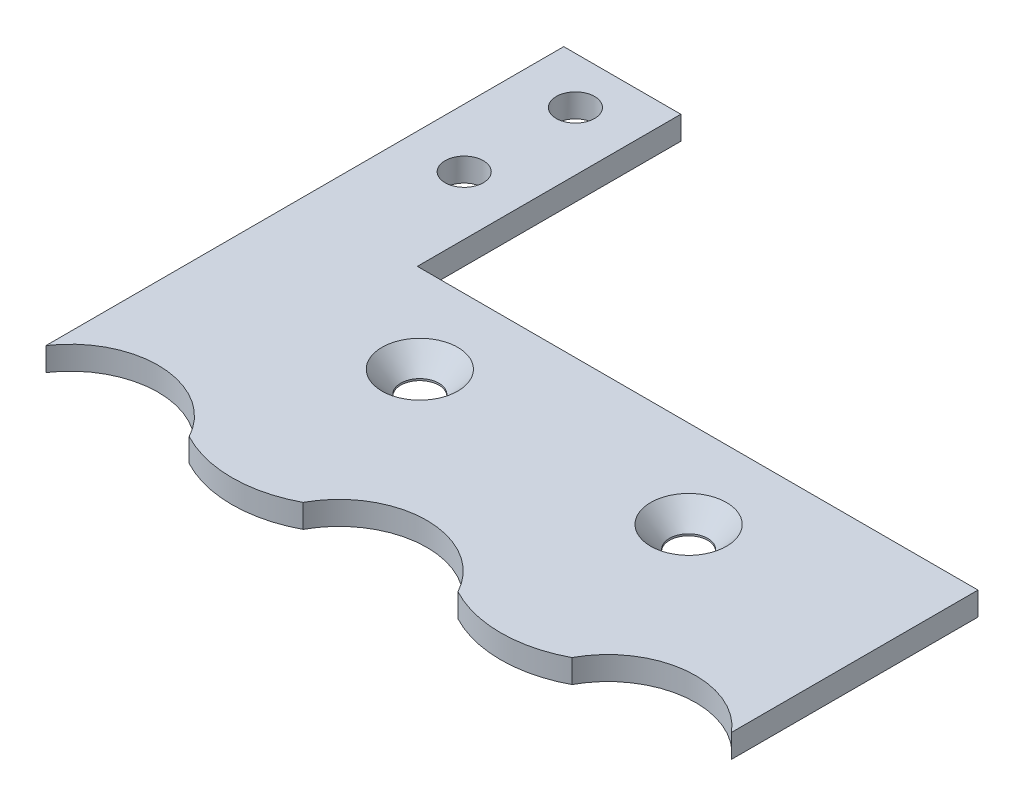
ISO-10303-21;
HEADER;
FILE_DESCRIPTION(('STEP AP214'),'2;1');
FILE_NAME('part.step','',(''),(''),'','','');
FILE_SCHEMA(('AUTOMOTIVE_DESIGN { 1 0 10303 214 1 1 1 1 }'));
ENDSEC;
DATA;
#1=APPLICATION_CONTEXT('core data for automotive mechanical design processes');
#2=APPLICATION_PROTOCOL_DEFINITION('international standard','automotive_design',2000,#1);
#3=PRODUCT_CONTEXT('',#1,'mechanical');
#4=PRODUCT('Part','Part','',(#3));
#5=PRODUCT_RELATED_PRODUCT_CATEGORY('part','',(#4));
#6=PRODUCT_DEFINITION_FORMATION('','',#4);
#7=PRODUCT_DEFINITION_CONTEXT('part definition',#1,'design');
#8=PRODUCT_DEFINITION('design','',#6,#7);
#9=PRODUCT_DEFINITION_SHAPE('','',#8);
#10=(LENGTH_UNIT() NAMED_UNIT(*) SI_UNIT(.MILLI.,.METRE.));
#11=(NAMED_UNIT(*) PLANE_ANGLE_UNIT() SI_UNIT($,.RADIAN.));
#12=(NAMED_UNIT(*) SI_UNIT($,.STERADIAN.) SOLID_ANGLE_UNIT());
#13=UNCERTAINTY_MEASURE_WITH_UNIT(LENGTH_MEASURE(1.E-05),#10,'distance_accuracy_value','');
#14=(GEOMETRIC_REPRESENTATION_CONTEXT(3) GLOBAL_UNCERTAINTY_ASSIGNED_CONTEXT((#13)) GLOBAL_UNIT_ASSIGNED_CONTEXT((#10,
#11,#12)) REPRESENTATION_CONTEXT('',''));
#15=CARTESIAN_POINT('',(0.,0.,0.));
#16=DIRECTION('',(0.,0.,1.));
#17=DIRECTION('',(1.,0.,0.));
#18=AXIS2_PLACEMENT_3D('',#15,#16,#17);
#19=CARTESIAN_POINT('',(-22.95,-2.,0.));
#20=DIRECTION('',(0.,-1.,0.));
#21=DIRECTION('',(0.,0.,-1.));
#22=AXIS2_PLACEMENT_3D('',#19,#20,#21);
#23=PLANE('',#22);
#24=DIRECTION('',(0.,0.,1.));
#25=VECTOR('',#24,1.);
#26=CARTESIAN_POINT('',(28.6876437453176,-2.,-25.875));
#27=LINE('',#26,#25);
#28=CARTESIAN_POINT('',(28.6876437453176,-2.,-25.875));
#29=VERTEX_POINT('',#28);
#30=CARTESIAN_POINT('',(28.6876437453176,-2.,-4.8300563404393));
#31=VERTEX_POINT('',#30);
#32=EDGE_CURVE('E130',#29,#31,#27,.T.);
#33=ORIENTED_EDGE('',*,*,#32,.T.);
#34=CARTESIAN_POINT('',(22.95,-2.,0.));
#35=DIRECTION('',(0.,-1.,0.));
#36=DIRECTION('',(0.,0.,-1.));
#37=AXIS2_PLACEMENT_3D('',#34,#35,#36);
#38=CIRCLE('',#37,7.5);
#39=CARTESIAN_POINT('',(16.3401340624036,-2.,-3.54396279424643));
#40=VERTEX_POINT('',#39);
#41=EDGE_CURVE('E200',#31,#40,#38,.F.);
#42=ORIENTED_EDGE('',*,*,#41,.T.);
#43=CARTESIAN_POINT('',(11.475,-2.,-12.7075371817243));
#44=DIRECTION('',(0.,-1.,0.));
#45=DIRECTION('',(0.,0.,-1.));
#46=AXIS2_PLACEMENT_3D('',#43,#44,#45);
#47=CIRCLE('',#46,10.375);
#48=CARTESIAN_POINT('',(6.6098659375964,-2.,-3.54396279424642));
#49=VERTEX_POINT('',#48);
#50=EDGE_CURVE('E196',#40,#49,#47,.T.);
#51=ORIENTED_EDGE('',*,*,#50,.T.);
#52=CARTESIAN_POINT('',(0.,-2.,0.));
#53=DIRECTION('',(0.,-1.,0.));
#54=DIRECTION('',(0.,0.,-1.));
#55=AXIS2_PLACEMENT_3D('',#52,#53,#54);
#56=CIRCLE('',#55,7.5);
#57=CARTESIAN_POINT('',(-6.6098659375964,-2.,-3.54396279424642));
#58=VERTEX_POINT('',#57);
#59=EDGE_CURVE('E192',#49,#58,#56,.F.);
#60=ORIENTED_EDGE('',*,*,#59,.T.);
#61=CARTESIAN_POINT('',(-11.475,-2.,-12.7075371817243));
#62=DIRECTION('',(0.,-1.,0.));
#63=DIRECTION('',(0.,0.,-1.));
#64=AXIS2_PLACEMENT_3D('',#61,#62,#63);
#65=CIRCLE('',#64,10.375);
#66=CARTESIAN_POINT('',(-16.3401340624036,-2.,-3.54396279424642));
#67=VERTEX_POINT('',#66);
#68=EDGE_CURVE('E188',#58,#67,#65,.T.);
#69=ORIENTED_EDGE('',*,*,#68,.T.);
#70=CARTESIAN_POINT('',(-22.95,-2.,0.));
#71=DIRECTION('',(0.,-1.,0.));
#72=DIRECTION('',(0.,0.,-1.));
#73=AXIS2_PLACEMENT_3D('',#70,#71,#72);
#74=CIRCLE('',#73,7.5);
#75=CARTESIAN_POINT('',(-29.1876437453176,-2.,-4.16434874938448));
#76=VERTEX_POINT('',#75);
#77=EDGE_CURVE('E183',#67,#76,#74,.F.);
#78=ORIENTED_EDGE('',*,*,#77,.T.);
#79=DIRECTION('',(0.,0.,1.));
#80=VECTOR('',#79,1.);
#81=CARTESIAN_POINT('',(-29.1876437453176,-2.,-25.875));
#82=LINE('',#81,#80);
#83=CARTESIAN_POINT('',(-29.1876437453176,-2.,-48.375));
#84=VERTEX_POINT('',#83);
#85=EDGE_CURVE('E159',#84,#76,#82,.T.);
#86=ORIENTED_EDGE('',*,*,#85,.F.);
#87=DIRECTION('',(-1.,0.,0.));
#88=VECTOR('',#87,1.);
#89=CARTESIAN_POINT('',(-29.1876437453176,-2.,-48.375));
#90=LINE('',#89,#88);
#91=CARTESIAN_POINT('',(-19.1876437453176,-2.,-48.375));
#92=VERTEX_POINT('',#91);
#93=EDGE_CURVE('E149',#92,#84,#90,.T.);
#94=ORIENTED_EDGE('',*,*,#93,.F.);
#95=DIRECTION('',(0.,0.,-1.));
#96=VECTOR('',#95,1.);
#97=CARTESIAN_POINT('',(-19.1876437453176,-2.,-48.375));
#98=LINE('',#97,#96);
#99=CARTESIAN_POINT('',(-19.1876437453176,-2.,-25.875));
#100=VERTEX_POINT('',#99);
#101=EDGE_CURVE('E147',#100,#92,#98,.T.);
#102=ORIENTED_EDGE('',*,*,#101,.F.);
#103=DIRECTION('',(-1.,0.,0.));
#104=VECTOR('',#103,1.);
#105=CARTESIAN_POINT('',(-19.1876437453176,-2.,-25.875));
#106=LINE('',#105,#104);
#107=EDGE_CURVE('E88',#29,#100,#106,.T.);
#108=ORIENTED_EDGE('',*,*,#107,.F.);
#109=EDGE_LOOP('',(#33,#42,#51,#60,#69,#78,#86,#94,#102,#108));
#110=FACE_BOUND('',#109,.T.);
#111=CARTESIAN_POINT('',(11.475,-2.,-18.375));
#112=DIRECTION('',(0.,-1.,0.));
#113=DIRECTION('',(0.,0.,-1.));
#114=AXIS2_PLACEMENT_3D('',#111,#112,#113);
#115=CIRCLE('',#114,1.63194999999999);
#116=CARTESIAN_POINT('',(11.475,-2.,-20.00695));
#117=VERTEX_POINT('',#116);
#118=EDGE_CURVE('E222',#117,#117,#115,.F.);
#119=ORIENTED_EDGE('',*,*,#118,.T.);
#120=EDGE_LOOP('',(#119));
#121=FACE_BOUND('',#120,.T.);
#122=CARTESIAN_POINT('',(-24.1876437453176,-2.,-44.375));
#123=DIRECTION('',(0.,-1.,0.));
#124=DIRECTION('',(0.,0.,-1.));
#125=AXIS2_PLACEMENT_3D('',#122,#123,#124);
#126=CIRCLE('',#125,1.635);
#127=CARTESIAN_POINT('',(-24.1876437453176,-2.,-46.01));
#128=VERTEX_POINT('',#127);
#129=EDGE_CURVE('E163',#128,#128,#126,.F.);
#130=ORIENTED_EDGE('',*,*,#129,.T.);
#131=EDGE_LOOP('',(#130));
#132=FACE_BOUND('',#131,.T.);
#133=CARTESIAN_POINT('',(-24.1876437453176,-2.,-34.875));
#134=DIRECTION('',(0.,-1.,0.));
#135=DIRECTION('',(0.,0.,-1.));
#136=AXIS2_PLACEMENT_3D('',#133,#134,#135);
#137=CIRCLE('',#136,1.635);
#138=CARTESIAN_POINT('',(-24.1876437453176,-2.,-36.51));
#139=VERTEX_POINT('',#138);
#140=EDGE_CURVE('E221',#139,#139,#137,.F.);
#141=ORIENTED_EDGE('',*,*,#140,.T.);
#142=EDGE_LOOP('',(#141));
#143=FACE_BOUND('',#142,.T.);
#144=CARTESIAN_POINT('',(-11.475,-2.,-18.375));
#145=DIRECTION('',(0.,-1.,0.));
#146=DIRECTION('',(0.,0.,-1.));
#147=AXIS2_PLACEMENT_3D('',#144,#145,#146);
#148=CIRCLE('',#147,1.63194999999999);
#149=CARTESIAN_POINT('',(-11.475,-2.,-20.00695));
#150=VERTEX_POINT('',#149);
#151=EDGE_CURVE('E213',#150,#150,#148,.F.);
#152=ORIENTED_EDGE('',*,*,#151,.T.);
#153=EDGE_LOOP('',(#152));
#154=FACE_BOUND('',#153,.T.);
#155=ADVANCED_FACE('F42',(#110,#121,#132,#143,#154),#23,.T.);
#156=CARTESIAN_POINT('',(-29.1876437453176,-2.,-3.17675943478572));
#157=DIRECTION('',(-1.,0.,0.));
#158=DIRECTION('',(0.,0.,1.));
#159=AXIS2_PLACEMENT_3D('',#156,#157,#158);
#160=PLANE('',#159);
#161=DIRECTION('',(0.,1.,0.));
#162=VECTOR('',#161,1.);
#163=CARTESIAN_POINT('',(-29.1876437453176,-72.327221103341,-4.16434874938448));
#164=LINE('',#163,#162);
#165=CARTESIAN_POINT('',(-29.1876437453176,0.,-4.16434874938448));
#166=VERTEX_POINT('',#165);
#167=EDGE_CURVE('E186',#166,#76,#164,.F.);
#168=ORIENTED_EDGE('',*,*,#167,.F.);
#169=DIRECTION('',(0.,0.,1.));
#170=VECTOR('',#169,1.);
#171=CARTESIAN_POINT('',(-29.1876437453176,0.,-3.17675943478572));
#172=LINE('',#171,#170);
#173=CARTESIAN_POINT('',(-29.1876437453176,0.,-48.375));
#174=VERTEX_POINT('',#173);
#175=EDGE_CURVE('E82',#174,#166,#172,.T.);
#176=ORIENTED_EDGE('',*,*,#175,.F.);
#177=DIRECTION('',(0.,1.,0.));
#178=VECTOR('',#177,1.);
#179=CARTESIAN_POINT('',(-29.1876437453176,-2.,-48.375));
#180=LINE('',#179,#178);
#181=EDGE_CURVE('E11',#84,#174,#180,.T.);
#182=ORIENTED_EDGE('',*,*,#181,.F.);
#183=ORIENTED_EDGE('',*,*,#85,.T.);
#184=EDGE_LOOP('',(#168,#176,#182,#183));
#185=FACE_BOUND('',#184,.T.);
#186=ADVANCED_FACE('F255',(#185),#160,.T.);
#187=CARTESIAN_POINT('',(-29.1876437453176,-2.,-48.375));
#188=DIRECTION('',(0.,0.,-1.));
#189=DIRECTION('',(-1.,0.,0.));
#190=AXIS2_PLACEMENT_3D('',#187,#188,#189);
#191=PLANE('',#190);
#192=DIRECTION('',(-1.,0.,0.));
#193=VECTOR('',#192,1.);
#194=CARTESIAN_POINT('',(-29.1876437453176,0.,-48.375));
#195=LINE('',#194,#193);
#196=CARTESIAN_POINT('',(-19.1876437453176,0.,-48.375));
#197=VERTEX_POINT('',#196);
#198=EDGE_CURVE('E151',#197,#174,#195,.T.);
#199=ORIENTED_EDGE('',*,*,#198,.F.);
#200=DIRECTION('',(0.,1.,0.));
#201=VECTOR('',#200,1.);
#202=CARTESIAN_POINT('',(-19.1876437453176,-2.,-48.375));
#203=LINE('',#202,#201);
#204=EDGE_CURVE('E51',#92,#197,#203,.T.);
#205=ORIENTED_EDGE('',*,*,#204,.F.);
#206=ORIENTED_EDGE('',*,*,#93,.T.);
#207=ORIENTED_EDGE('',*,*,#181,.T.);
#208=EDGE_LOOP('',(#199,#205,#206,#207));
#209=FACE_BOUND('',#208,.T.);
#210=ADVANCED_FACE('F260',(#209),#191,.T.);
#211=CARTESIAN_POINT('',(-19.1876437453176,-2.,-48.375));
#212=DIRECTION('',(1.,0.,0.));
#213=DIRECTION('',(0.,0.,-1.));
#214=AXIS2_PLACEMENT_3D('',#211,#212,#213);
#215=PLANE('',#214);
#216=DIRECTION('',(0.,0.,-1.));
#217=VECTOR('',#216,1.);
#218=CARTESIAN_POINT('',(-19.1876437453176,0.,-48.375));
#219=LINE('',#218,#217);
#220=CARTESIAN_POINT('',(-19.1876437453176,0.,-25.875));
#221=VERTEX_POINT('',#220);
#222=EDGE_CURVE('E162',#221,#197,#219,.T.);
#223=ORIENTED_EDGE('',*,*,#222,.F.);
#224=DIRECTION('',(0.,1.,0.));
#225=VECTOR('',#224,1.);
#226=CARTESIAN_POINT('',(-19.1876437453176,-2.,-25.875));
#227=LINE('',#226,#225);
#228=EDGE_CURVE('E46',#100,#221,#227,.T.);
#229=ORIENTED_EDGE('',*,*,#228,.F.);
#230=ORIENTED_EDGE('',*,*,#101,.T.);
#231=ORIENTED_EDGE('',*,*,#204,.T.);
#232=EDGE_LOOP('',(#223,#229,#230,#231));
#233=FACE_BOUND('',#232,.T.);
#234=ADVANCED_FACE('F170',(#233),#215,.T.);
#235=CARTESIAN_POINT('',(-19.1876437453176,-2.,-25.875));
#236=DIRECTION('',(0.,0.,-1.));
#237=DIRECTION('',(-1.,0.,0.));
#238=AXIS2_PLACEMENT_3D('',#235,#236,#237);
#239=PLANE('',#238);
#240=DIRECTION('',(0.,1.,0.));
#241=VECTOR('',#240,1.);
#242=CARTESIAN_POINT('',(28.6876437453176,-72.327221103341,-25.875));
#243=LINE('',#242,#241);
#244=CARTESIAN_POINT('',(28.6876437453176,0.,-25.875));
#245=VERTEX_POINT('',#244);
#246=EDGE_CURVE('E133',#29,#245,#243,.T.);
#247=ORIENTED_EDGE('',*,*,#246,.F.);
#248=ORIENTED_EDGE('',*,*,#107,.T.);
#249=ORIENTED_EDGE('',*,*,#228,.T.);
#250=DIRECTION('',(-1.,0.,0.));
#251=VECTOR('',#250,1.);
#252=CARTESIAN_POINT('',(-19.1876437453176,0.,-25.875));
#253=LINE('',#252,#251);
#254=EDGE_CURVE('E140',#245,#221,#253,.T.);
#255=ORIENTED_EDGE('',*,*,#254,.F.);
#256=EDGE_LOOP('',(#247,#248,#249,#255));
#257=FACE_BOUND('',#256,.T.);
#258=ADVANCED_FACE('F44',(#257),#239,.T.);
#259=CARTESIAN_POINT('',(-22.95,0.,0.));
#260=DIRECTION('',(0.,-1.,0.));
#261=DIRECTION('',(0.,0.,-1.));
#262=AXIS2_PLACEMENT_3D('',#259,#260,#261);
#263=PLANE('',#262);
#264=CARTESIAN_POINT('',(-11.475,0.,-18.375));
#265=DIRECTION('',(0.,1.,0.));
#266=DIRECTION('',(0.,0.,1.));
#267=AXIS2_PLACEMENT_3D('',#264,#265,#266);
#268=CIRCLE('',#267,3.2385);
#269=CARTESIAN_POINT('',(-11.475,0.,-15.1365));
#270=VERTEX_POINT('',#269);
#271=EDGE_CURVE('E208',#270,#270,#268,.T.);
#272=ORIENTED_EDGE('',*,*,#271,.F.);
#273=EDGE_LOOP('',(#272));
#274=FACE_BOUND('',#273,.T.);
#275=CARTESIAN_POINT('',(11.475,0.,-18.375));
#276=DIRECTION('',(0.,1.,0.));
#277=DIRECTION('',(0.,0.,1.));
#278=AXIS2_PLACEMENT_3D('',#275,#276,#277);
#279=CIRCLE('',#278,3.2385);
#280=CARTESIAN_POINT('',(11.475,0.,-15.1365));
#281=VERTEX_POINT('',#280);
#282=EDGE_CURVE('E212',#281,#281,#279,.T.);
#283=ORIENTED_EDGE('',*,*,#282,.F.);
#284=EDGE_LOOP('',(#283));
#285=FACE_BOUND('',#284,.T.);
#286=CARTESIAN_POINT('',(-24.1876437453176,0.,-44.375));
#287=DIRECTION('',(0.,1.,0.));
#288=DIRECTION('',(0.,0.,1.));
#289=AXIS2_PLACEMENT_3D('',#286,#287,#288);
#290=CIRCLE('',#289,1.635);
#291=CARTESIAN_POINT('',(-24.1876437453176,0.,-42.74));
#292=VERTEX_POINT('',#291);
#293=EDGE_CURVE('E227',#292,#292,#290,.T.);
#294=ORIENTED_EDGE('',*,*,#293,.F.);
#295=EDGE_LOOP('',(#294));
#296=FACE_BOUND('',#295,.T.);
#297=CARTESIAN_POINT('',(-24.1876437453176,0.,-34.875));
#298=DIRECTION('',(0.,1.,0.));
#299=DIRECTION('',(0.,0.,1.));
#300=AXIS2_PLACEMENT_3D('',#297,#298,#299);
#301=CIRCLE('',#300,1.635);
#302=CARTESIAN_POINT('',(-24.1876437453176,0.,-33.24));
#303=VERTEX_POINT('',#302);
#304=EDGE_CURVE('E154',#303,#303,#301,.T.);
#305=ORIENTED_EDGE('',*,*,#304,.F.);
#306=EDGE_LOOP('',(#305));
#307=FACE_BOUND('',#306,.T.);
#308=CARTESIAN_POINT('',(22.95,0.,0.));
#309=DIRECTION('',(0.,1.,0.));
#310=DIRECTION('',(0.,0.,1.));
#311=AXIS2_PLACEMENT_3D('',#308,#309,#310);
#312=CIRCLE('',#311,7.5);
#313=CARTESIAN_POINT('',(28.6876437453176,0.,-4.8300563404393));
#314=VERTEX_POINT('',#313);
#315=CARTESIAN_POINT('',(16.3401340624036,0.,-3.54396279424643));
#316=VERTEX_POINT('',#315);
#317=EDGE_CURVE('E177',#314,#316,#312,.T.);
#318=ORIENTED_EDGE('',*,*,#317,.F.);
#319=DIRECTION('',(0.,0.,1.));
#320=VECTOR('',#319,1.);
#321=CARTESIAN_POINT('',(28.6876437453176,0.,-25.875));
#322=LINE('',#321,#320);
#323=EDGE_CURVE('E174',#245,#314,#322,.T.);
#324=ORIENTED_EDGE('',*,*,#323,.F.);
#325=ORIENTED_EDGE('',*,*,#254,.T.);
#326=ORIENTED_EDGE('',*,*,#222,.T.);
#327=ORIENTED_EDGE('',*,*,#198,.T.);
#328=ORIENTED_EDGE('',*,*,#175,.T.);
#329=CARTESIAN_POINT('',(-22.95,0.,0.));
#330=DIRECTION('',(0.,1.,0.));
#331=DIRECTION('',(0.,0.,1.));
#332=AXIS2_PLACEMENT_3D('',#329,#330,#331);
#333=CIRCLE('',#332,7.5);
#334=CARTESIAN_POINT('',(-16.3401340624036,0.,-3.54396279424642));
#335=VERTEX_POINT('',#334);
#336=EDGE_CURVE('E141',#335,#166,#333,.T.);
#337=ORIENTED_EDGE('',*,*,#336,.F.);
#338=CARTESIAN_POINT('',(-11.475,0.,-12.7075371817243));
#339=DIRECTION('',(0.,-1.,0.));
#340=DIRECTION('',(0.,0.,1.));
#341=AXIS2_PLACEMENT_3D('',#338,#339,#340);
#342=CIRCLE('',#341,10.375);
#343=CARTESIAN_POINT('',(-6.6098659375964,0.,-3.54396279424642));
#344=VERTEX_POINT('',#343);
#345=EDGE_CURVE('E59',#344,#335,#342,.T.);
#346=ORIENTED_EDGE('',*,*,#345,.F.);
#347=CARTESIAN_POINT('',(0.,0.,0.));
#348=DIRECTION('',(0.,1.,0.));
#349=DIRECTION('',(0.,0.,1.));
#350=AXIS2_PLACEMENT_3D('',#347,#348,#349);
#351=CIRCLE('',#350,7.5);
#352=CARTESIAN_POINT('',(6.6098659375964,0.,-3.54396279424642));
#353=VERTEX_POINT('',#352);
#354=EDGE_CURVE('E306',#353,#344,#351,.T.);
#355=ORIENTED_EDGE('',*,*,#354,.F.);
#356=CARTESIAN_POINT('',(11.475,0.,-12.7075371817243));
#357=DIRECTION('',(0.,-1.,0.));
#358=DIRECTION('',(0.,0.,1.));
#359=AXIS2_PLACEMENT_3D('',#356,#357,#358);
#360=CIRCLE('',#359,10.375);
#361=EDGE_CURVE('E179',#316,#353,#360,.T.);
#362=ORIENTED_EDGE('',*,*,#361,.F.);
#363=EDGE_LOOP('',(#318,#324,#325,#326,#327,#328,#337,#346,#355,#362));
#364=FACE_BOUND('',#363,.T.);
#365=ADVANCED_FACE('F173',(#274,#285,#296,#307,#364),#263,.F.);
#366=CARTESIAN_POINT('',(-24.1876437453176,-6.62447834896003,-34.875));
#367=DIRECTION('',(0.,1.,0.));
#368=DIRECTION('',(0.,0.,1.));
#369=AXIS2_PLACEMENT_3D('',#366,#367,#368);
#370=CYLINDRICAL_SURFACE('',#369,1.635);
#371=ORIENTED_EDGE('',*,*,#304,.T.);
#372=EDGE_LOOP('',(#371));
#373=FACE_BOUND('',#372,.T.);
#374=ORIENTED_EDGE('',*,*,#140,.F.);
#375=EDGE_LOOP('',(#374));
#376=FACE_BOUND('',#375,.T.);
#377=ADVANCED_FACE('F237',(#373,#376),#370,.F.);
#378=CARTESIAN_POINT('',(-24.1876437453176,-6.62447834896003,-44.375));
#379=DIRECTION('',(0.,1.,0.));
#380=DIRECTION('',(0.,0.,1.));
#381=AXIS2_PLACEMENT_3D('',#378,#379,#380);
#382=CYLINDRICAL_SURFACE('',#381,1.635);
#383=ORIENTED_EDGE('',*,*,#293,.T.);
#384=EDGE_LOOP('',(#383));
#385=FACE_BOUND('',#384,.T.);
#386=ORIENTED_EDGE('',*,*,#129,.F.);
#387=EDGE_LOOP('',(#386));
#388=FACE_BOUND('',#387,.T.);
#389=ADVANCED_FACE('F248',(#385,#388),#382,.F.);
#390=CARTESIAN_POINT('',(11.475,0.,-18.375));
#391=DIRECTION('',(0.,1.,0.));
#392=DIRECTION('',(0.,0.,1.));
#393=AXIS2_PLACEMENT_3D('',#390,#391,#392);
#394=CYLINDRICAL_SURFACE('',#393,1.63194999999999);
#395=ORIENTED_EDGE('',*,*,#118,.F.);
#396=EDGE_LOOP('',(#395));
#397=FACE_BOUND('',#396,.T.);
#398=CARTESIAN_POINT('',(11.475,-1.84812436462092,-18.375));
#399=DIRECTION('',(0.,1.,0.));
#400=DIRECTION('',(0.,0.,1.));
#401=AXIS2_PLACEMENT_3D('',#398,#399,#400);
#402=CIRCLE('',#401,1.63194999999999);
#403=CARTESIAN_POINT('',(11.475,-1.84812436462092,-16.74305));
#404=VERTEX_POINT('',#403);
#405=EDGE_CURVE('E218',#404,#404,#402,.T.);
#406=ORIENTED_EDGE('',*,*,#405,.T.);
#407=EDGE_LOOP('',(#406));
#408=FACE_BOUND('',#407,.T.);
#409=ADVANCED_FACE('F264',(#397,#408),#394,.F.);
#410=CARTESIAN_POINT('',(11.475,0.,-18.375));
#411=DIRECTION('',(0.,1.,0.));
#412=DIRECTION('',(0.,0.,1.));
#413=AXIS2_PLACEMENT_3D('',#410,#411,#412);
#414=CONICAL_SURFACE('',#413,3.2385,0.715584993317676);
#415=ORIENTED_EDGE('',*,*,#405,.F.);
#416=EDGE_LOOP('',(#415));
#417=FACE_BOUND('',#416,.T.);
#418=ORIENTED_EDGE('',*,*,#282,.T.);
#419=EDGE_LOOP('',(#418));
#420=FACE_BOUND('',#419,.T.);
#421=ADVANCED_FACE('F266',(#417,#420),#414,.F.);
#422=CARTESIAN_POINT('',(-11.475,0.,-18.375));
#423=DIRECTION('',(0.,1.,0.));
#424=DIRECTION('',(0.,0.,1.));
#425=AXIS2_PLACEMENT_3D('',#422,#423,#424);
#426=CYLINDRICAL_SURFACE('',#425,1.63194999999999);
#427=ORIENTED_EDGE('',*,*,#151,.F.);
#428=EDGE_LOOP('',(#427));
#429=FACE_BOUND('',#428,.T.);
#430=CARTESIAN_POINT('',(-11.475,-1.84812436462092,-18.375));
#431=DIRECTION('',(0.,1.,0.));
#432=DIRECTION('',(0.,0.,1.));
#433=AXIS2_PLACEMENT_3D('',#430,#431,#432);
#434=CIRCLE('',#433,1.63194999999999);
#435=CARTESIAN_POINT('',(-11.475,-1.84812436462092,-16.74305));
#436=VERTEX_POINT('',#435);
#437=EDGE_CURVE('E209',#436,#436,#434,.T.);
#438=ORIENTED_EDGE('',*,*,#437,.T.);
#439=EDGE_LOOP('',(#438));
#440=FACE_BOUND('',#439,.T.);
#441=ADVANCED_FACE('F269',(#429,#440),#426,.F.);
#442=CARTESIAN_POINT('',(-11.475,0.,-18.375));
#443=DIRECTION('',(0.,1.,0.));
#444=DIRECTION('',(0.,0.,1.));
#445=AXIS2_PLACEMENT_3D('',#442,#443,#444);
#446=CONICAL_SURFACE('',#445,3.2385,0.715584993317676);
#447=ORIENTED_EDGE('',*,*,#437,.F.);
#448=EDGE_LOOP('',(#447));
#449=FACE_BOUND('',#448,.T.);
#450=ORIENTED_EDGE('',*,*,#271,.T.);
#451=EDGE_LOOP('',(#450));
#452=FACE_BOUND('',#451,.T.);
#453=ADVANCED_FACE('F274',(#449,#452),#446,.F.);
#454=CARTESIAN_POINT('',(28.6876437453176,-72.327221103341,-25.875));
#455=DIRECTION('',(-1.,0.,0.));
#456=DIRECTION('',(0.,0.,1.));
#457=AXIS2_PLACEMENT_3D('',#454,#455,#456);
#458=PLANE('',#457);
#459=ORIENTED_EDGE('',*,*,#246,.T.);
#460=ORIENTED_EDGE('',*,*,#323,.T.);
#461=DIRECTION('',(0.,1.,0.));
#462=VECTOR('',#461,1.);
#463=CARTESIAN_POINT('',(28.6876437453176,-72.327221103341,-4.8300563404393));
#464=LINE('',#463,#462);
#465=EDGE_CURVE('E135',#31,#314,#464,.T.);
#466=ORIENTED_EDGE('',*,*,#465,.F.);
#467=ORIENTED_EDGE('',*,*,#32,.F.);
#468=EDGE_LOOP('',(#459,#460,#466,#467));
#469=FACE_BOUND('',#468,.T.);
#470=ADVANCED_FACE('F131',(#469),#458,.F.);
#471=CARTESIAN_POINT('',(22.95,-72.327221103341,0.));
#472=DIRECTION('',(0.,1.,0.));
#473=DIRECTION('',(0.,0.,1.));
#474=AXIS2_PLACEMENT_3D('',#471,#472,#473);
#475=CYLINDRICAL_SURFACE('',#474,7.5);
#476=ORIENTED_EDGE('',*,*,#465,.T.);
#477=ORIENTED_EDGE('',*,*,#317,.T.);
#478=DIRECTION('',(0.,1.,0.));
#479=VECTOR('',#478,1.);
#480=CARTESIAN_POINT('',(16.3401340624036,-72.327221103341,-3.54396279424643));
#481=LINE('',#480,#479);
#482=EDGE_CURVE('E199',#40,#316,#481,.T.);
#483=ORIENTED_EDGE('',*,*,#482,.F.);
#484=ORIENTED_EDGE('',*,*,#41,.F.);
#485=EDGE_LOOP('',(#476,#477,#483,#484));
#486=FACE_BOUND('',#485,.T.);
#487=ADVANCED_FACE('F281',(#486),#475,.F.);
#488=CARTESIAN_POINT('',(11.475,-72.327221103341,-12.7075371817243));
#489=DIRECTION('',(0.,1.,0.));
#490=DIRECTION('',(0.,0.,1.));
#491=AXIS2_PLACEMENT_3D('',#488,#489,#490);
#492=CYLINDRICAL_SURFACE('',#491,10.375);
#493=ORIENTED_EDGE('',*,*,#482,.T.);
#494=ORIENTED_EDGE('',*,*,#361,.T.);
#495=DIRECTION('',(0.,1.,0.));
#496=VECTOR('',#495,1.);
#497=CARTESIAN_POINT('',(6.6098659375964,-72.327221103341,-3.54396279424642));
#498=LINE('',#497,#496);
#499=EDGE_CURVE('E195',#49,#353,#498,.T.);
#500=ORIENTED_EDGE('',*,*,#499,.F.);
#501=ORIENTED_EDGE('',*,*,#50,.F.);
#502=EDGE_LOOP('',(#493,#494,#500,#501));
#503=FACE_BOUND('',#502,.T.);
#504=ADVANCED_FACE('F284',(#503),#492,.T.);
#505=CARTESIAN_POINT('',(0.,-72.327221103341,0.));
#506=DIRECTION('',(0.,1.,0.));
#507=DIRECTION('',(0.,0.,1.));
#508=AXIS2_PLACEMENT_3D('',#505,#506,#507);
#509=CYLINDRICAL_SURFACE('',#508,7.5);
#510=ORIENTED_EDGE('',*,*,#499,.T.);
#511=ORIENTED_EDGE('',*,*,#354,.T.);
#512=DIRECTION('',(0.,1.,0.));
#513=VECTOR('',#512,1.);
#514=CARTESIAN_POINT('',(-6.6098659375964,-72.327221103341,-3.54396279424642));
#515=LINE('',#514,#513);
#516=EDGE_CURVE('E191',#58,#344,#515,.T.);
#517=ORIENTED_EDGE('',*,*,#516,.F.);
#518=ORIENTED_EDGE('',*,*,#59,.F.);
#519=EDGE_LOOP('',(#510,#511,#517,#518));
#520=FACE_BOUND('',#519,.T.);
#521=ADVANCED_FACE('F288',(#520),#509,.F.);
#522=CARTESIAN_POINT('',(-11.475,-72.327221103341,-12.7075371817243));
#523=DIRECTION('',(0.,1.,0.));
#524=DIRECTION('',(0.,0.,1.));
#525=AXIS2_PLACEMENT_3D('',#522,#523,#524);
#526=CYLINDRICAL_SURFACE('',#525,10.375);
#527=ORIENTED_EDGE('',*,*,#516,.T.);
#528=ORIENTED_EDGE('',*,*,#345,.T.);
#529=DIRECTION('',(0.,1.,0.));
#530=VECTOR('',#529,1.);
#531=CARTESIAN_POINT('',(-16.3401340624036,-72.327221103341,-3.54396279424643));
#532=LINE('',#531,#530);
#533=EDGE_CURVE('E187',#67,#335,#532,.T.);
#534=ORIENTED_EDGE('',*,*,#533,.F.);
#535=ORIENTED_EDGE('',*,*,#68,.F.);
#536=EDGE_LOOP('',(#527,#528,#534,#535));
#537=FACE_BOUND('',#536,.T.);
#538=ADVANCED_FACE('F292',(#537),#526,.T.);
#539=CARTESIAN_POINT('',(-22.95,-72.327221103341,0.));
#540=DIRECTION('',(0.,1.,0.));
#541=DIRECTION('',(0.,0.,1.));
#542=AXIS2_PLACEMENT_3D('',#539,#540,#541);
#543=CYLINDRICAL_SURFACE('',#542,7.5);
#544=ORIENTED_EDGE('',*,*,#167,.T.);
#545=ORIENTED_EDGE('',*,*,#77,.F.);
#546=ORIENTED_EDGE('',*,*,#533,.T.);
#547=ORIENTED_EDGE('',*,*,#336,.T.);
#548=EDGE_LOOP('',(#544,#545,#546,#547));
#549=FACE_BOUND('',#548,.T.);
#550=ADVANCED_FACE('F296',(#549),#543,.F.);
#551=CLOSED_SHELL('',(#155,#186,#210,#234,#258,#365,#377,#389,#409,#421,#441,#453,#470,#487,
#504,#521,#538,#550));
#552=MANIFOLD_SOLID_BREP('B2',#551);
#553=ADVANCED_BREP_SHAPE_REPRESENTATION('',(#18,#552),#14);
#554=SHAPE_DEFINITION_REPRESENTATION(#9,#553);
ENDSEC;
END-ISO-10303-21;
